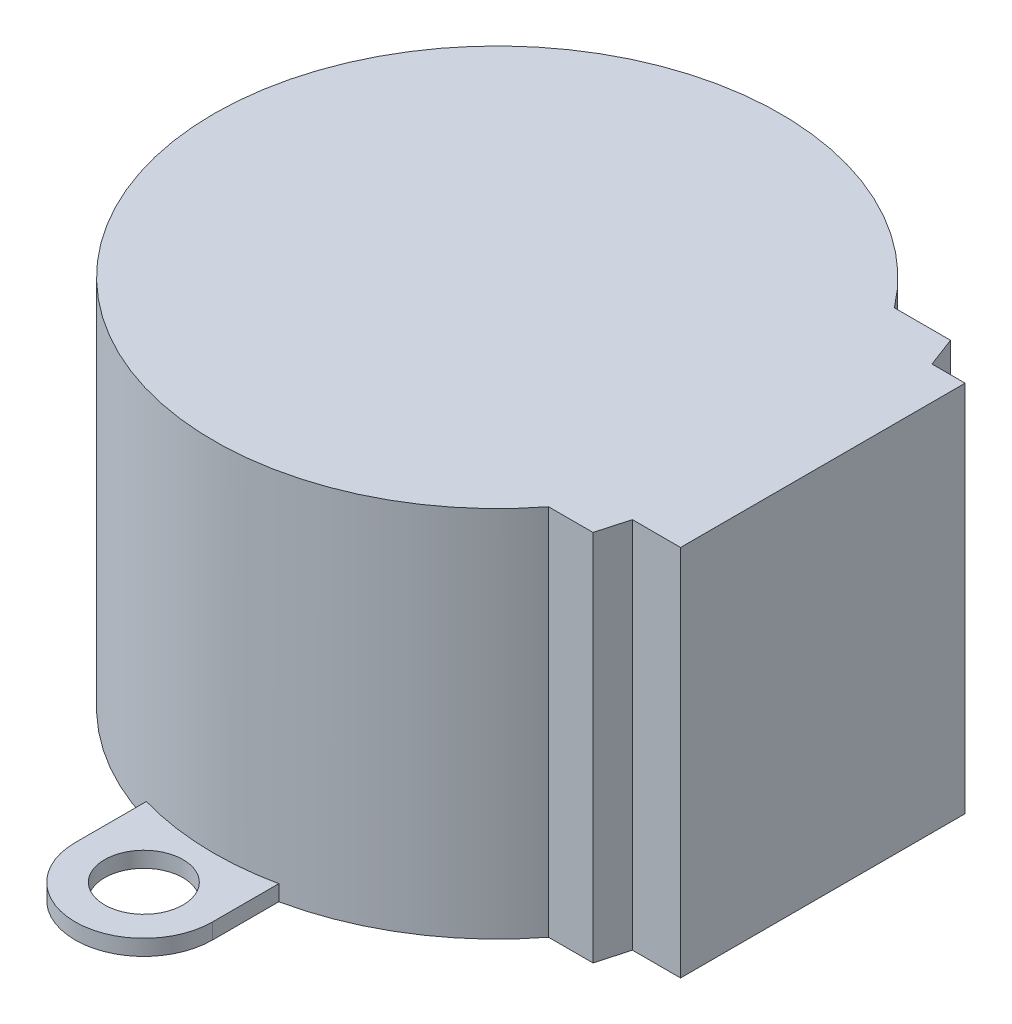
ISO-10303-21;
HEADER;
FILE_DESCRIPTION(('STEP AP214'),'2;1');
FILE_NAME('part.step','',(''),(''),'','','');
FILE_SCHEMA(('AUTOMOTIVE_DESIGN { 1 0 10303 214 1 1 1 1 }'));
ENDSEC;
DATA;
#1=APPLICATION_CONTEXT('core data for automotive mechanical design processes');
#2=APPLICATION_PROTOCOL_DEFINITION('international standard','automotive_design',2000,#1);
#3=PRODUCT_CONTEXT('',#1,'mechanical');
#4=PRODUCT('Part','Part','',(#3));
#5=PRODUCT_RELATED_PRODUCT_CATEGORY('part','',(#4));
#6=PRODUCT_DEFINITION_FORMATION('','',#4);
#7=PRODUCT_DEFINITION_CONTEXT('part definition',#1,'design');
#8=PRODUCT_DEFINITION('design','',#6,#7);
#9=PRODUCT_DEFINITION_SHAPE('','',#8);
#10=(LENGTH_UNIT() NAMED_UNIT(*) SI_UNIT(.MILLI.,.METRE.));
#11=(NAMED_UNIT(*) PLANE_ANGLE_UNIT() SI_UNIT($,.RADIAN.));
#12=(NAMED_UNIT(*) SI_UNIT($,.STERADIAN.) SOLID_ANGLE_UNIT());
#13=UNCERTAINTY_MEASURE_WITH_UNIT(LENGTH_MEASURE(1.E-05),#10,'distance_accuracy_value','');
#14=(GEOMETRIC_REPRESENTATION_CONTEXT(3) GLOBAL_UNCERTAINTY_ASSIGNED_CONTEXT((#13)) GLOBAL_UNIT_ASSIGNED_CONTEXT((#10,
#11,#12)) REPRESENTATION_CONTEXT('',''));
#15=CARTESIAN_POINT('',(0.,0.,0.));
#16=DIRECTION('',(0.,0.,1.));
#17=DIRECTION('',(1.,0.,0.));
#18=AXIS2_PLACEMENT_3D('',#15,#16,#17);
#19=CARTESIAN_POINT('',(0.,19.,0.));
#20=DIRECTION('',(0.,-1.,0.));
#21=DIRECTION('',(0.,0.,-1.));
#22=AXIS2_PLACEMENT_3D('',#19,#20,#21);
#23=CYLINDRICAL_SURFACE('',#22,14.436967708982);
#24=CARTESIAN_POINT('',(0.,0.,0.));
#25=DIRECTION('',(0.,1.,0.));
#26=DIRECTION('',(0.,0.,1.));
#27=AXIS2_PLACEMENT_3D('',#24,#25,#26);
#28=CIRCLE('',#27,14.436967708982);
#29=CARTESIAN_POINT('',(-4.00623475222368,0.,-13.8699718723675));
#30=VERTEX_POINT('',#29);
#31=CARTESIAN_POINT('',(-4.00623475222368,0.,13.8699718723675));
#32=VERTEX_POINT('',#31);
#33=EDGE_CURVE('E441',#30,#32,#28,.T.);
#34=ORIENTED_EDGE('',*,*,#33,.T.);
#35=DIRECTION('',(0.,-1.,0.));
#36=VECTOR('',#35,1.);
#37=CARTESIAN_POINT('',(-4.00623475222368,0.8,13.8699718723675));
#38=LINE('',#37,#36);
#39=CARTESIAN_POINT('',(-4.00623475222368,0.799999999999999,13.8699718723675));
#40=VERTEX_POINT('',#39);
#41=EDGE_CURVE('E323',#40,#32,#38,.T.);
#42=ORIENTED_EDGE('',*,*,#41,.F.);
#43=CARTESIAN_POINT('',(0.,0.8,0.));
#44=DIRECTION('',(0.,1.,0.));
#45=DIRECTION('',(0.,0.,1.));
#46=AXIS2_PLACEMENT_3D('',#43,#44,#45);
#47=CIRCLE('',#46,14.436967708982);
#48=CARTESIAN_POINT('',(2.99376524777633,0.799999999999999,14.1231514284665));
#49=VERTEX_POINT('',#48);
#50=EDGE_CURVE('E320',#40,#49,#47,.T.);
#51=ORIENTED_EDGE('',*,*,#50,.T.);
#52=DIRECTION('',(0.,-1.,0.));
#53=VECTOR('',#52,1.);
#54=CARTESIAN_POINT('',(2.99376524777633,0.8,14.1231514284665));
#55=LINE('',#54,#53);
#56=CARTESIAN_POINT('',(2.99376524777633,0.,14.1231514284665));
#57=VERTEX_POINT('',#56);
#58=EDGE_CURVE('E341',#49,#57,#55,.T.);
#59=ORIENTED_EDGE('',*,*,#58,.T.);
#60=CARTESIAN_POINT('',(11.4313797143374,0.,8.81757304800058));
#61=VERTEX_POINT('',#60);
#62=EDGE_CURVE('E403',#57,#61,#28,.T.);
#63=ORIENTED_EDGE('',*,*,#62,.T.);
#64=DIRECTION('',(0.,-1.,0.));
#65=VECTOR('',#64,1.);
#66=CARTESIAN_POINT('',(11.4313797143374,19.,8.81757304800058));
#67=LINE('',#66,#65);
#68=CARTESIAN_POINT('',(11.4313797143374,19.,8.81757304800058));
#69=VERTEX_POINT('',#68);
#70=EDGE_CURVE('E260',#69,#61,#67,.T.);
#71=ORIENTED_EDGE('',*,*,#70,.F.);
#72=CARTESIAN_POINT('',(0.,19.,0.));
#73=DIRECTION('',(0.,1.,0.));
#74=DIRECTION('',(0.,0.,1.));
#75=AXIS2_PLACEMENT_3D('',#72,#73,#74);
#76=CIRCLE('',#75,14.436967708982);
#77=CARTESIAN_POINT('',(11.4669357034647,19.,-8.77128395406261));
#78=VERTEX_POINT('',#77);
#79=EDGE_CURVE('E407',#78,#69,#76,.T.);
#80=ORIENTED_EDGE('',*,*,#79,.F.);
#81=DIRECTION('',(0.,-1.,0.));
#82=VECTOR('',#81,1.);
#83=CARTESIAN_POINT('',(11.4669357034647,19.,-8.77128395406261));
#84=LINE('',#83,#82);
#85=CARTESIAN_POINT('',(11.4669357034647,0.,-8.77128395406261));
#86=VERTEX_POINT('',#85);
#87=EDGE_CURVE('E437',#78,#86,#84,.T.);
#88=ORIENTED_EDGE('',*,*,#87,.T.);
#89=CARTESIAN_POINT('',(2.99376524777633,0.,-14.1231514284665));
#90=VERTEX_POINT('',#89);
#91=EDGE_CURVE('E438',#86,#90,#28,.T.);
#92=ORIENTED_EDGE('',*,*,#91,.T.);
#93=DIRECTION('',(0.,-1.,0.));
#94=VECTOR('',#93,1.);
#95=CARTESIAN_POINT('',(2.99376524777633,0.8,-14.1231514284665));
#96=LINE('',#95,#94);
#97=CARTESIAN_POINT('',(2.99376524777633,0.799999999999999,-14.1231514284665));
#98=VERTEX_POINT('',#97);
#99=EDGE_CURVE('E372',#98,#90,#96,.T.);
#100=ORIENTED_EDGE('',*,*,#99,.F.);
#101=CARTESIAN_POINT('',(0.,0.8,0.));
#102=DIRECTION('',(0.,1.,0.));
#103=DIRECTION('',(0.,0.,1.));
#104=AXIS2_PLACEMENT_3D('',#101,#102,#103);
#105=CIRCLE('',#104,14.436967708982);
#106=CARTESIAN_POINT('',(-4.00623475222368,0.799999999999999,-13.8699718723675));
#107=VERTEX_POINT('',#106);
#108=EDGE_CURVE('E369',#98,#107,#105,.T.);
#109=ORIENTED_EDGE('',*,*,#108,.T.);
#110=DIRECTION('',(0.,-1.,0.));
#111=VECTOR('',#110,1.);
#112=CARTESIAN_POINT('',(-4.00623475222368,0.8,-13.8699718723675));
#113=LINE('',#112,#111);
#114=EDGE_CURVE('E388',#107,#30,#113,.T.);
#115=ORIENTED_EDGE('',*,*,#114,.T.);
#116=EDGE_LOOP('',(#34,#42,#51,#59,#63,#71,#80,#88,#92,#100,#109,#115));
#117=FACE_BOUND('',#116,.T.);
#118=ADVANCED_FACE('F40',(#117),#23,.T.);
#119=CARTESIAN_POINT('',(0.,19.,8.81757304800058));
#120=DIRECTION('',(0.,0.,-1.));
#121=DIRECTION('',(-1.,0.,0.));
#122=AXIS2_PLACEMENT_3D('',#119,#120,#121);
#123=PLANE('',#122);
#124=DIRECTION('',(1.,0.,0.));
#125=VECTOR('',#124,1.);
#126=CARTESIAN_POINT('',(0.,0.,8.81757304800058));
#127=LINE('',#126,#125);
#128=CARTESIAN_POINT('',(13.7006228905011,0.,8.81757304800058));
#129=VERTEX_POINT('',#128);
#130=EDGE_CURVE('E440',#61,#129,#127,.T.);
#131=ORIENTED_EDGE('',*,*,#130,.T.);
#132=DIRECTION('',(0.,-1.,0.));
#133=VECTOR('',#132,1.);
#134=CARTESIAN_POINT('',(13.7006228905011,19.,8.81757304800058));
#135=LINE('',#134,#133);
#136=CARTESIAN_POINT('',(13.7006228905011,19.,8.81757304800058));
#137=VERTEX_POINT('',#136);
#138=EDGE_CURVE('E478',#137,#129,#135,.T.);
#139=ORIENTED_EDGE('',*,*,#138,.F.);
#140=DIRECTION('',(1.,0.,0.));
#141=VECTOR('',#140,1.);
#142=CARTESIAN_POINT('',(0.,19.,8.81757304800058));
#143=LINE('',#142,#141);
#144=EDGE_CURVE('E411',#69,#137,#143,.T.);
#145=ORIENTED_EDGE('',*,*,#144,.F.);
#146=ORIENTED_EDGE('',*,*,#70,.T.);
#147=EDGE_LOOP('',(#131,#139,#145,#146));
#148=FACE_BOUND('',#147,.T.);
#149=ADVANCED_FACE('F495',(#148),#123,.F.);
#150=CARTESIAN_POINT('',(14.9938451519472,19.,4.1919357019295));
#151=DIRECTION('',(-0.963069694716314,0.,-0.269252229552563));
#152=DIRECTION('',(-0.269252229552563,0.,0.963069694716314));
#153=AXIS2_PLACEMENT_3D('',#150,#151,#152);
#154=PLANE('',#153);
#155=DIRECTION('',(0.269252229552563,0.,-0.963069694716314));
#156=VECTOR('',#155,1.);
#157=CARTESIAN_POINT('',(14.9938451519472,0.,4.1919357019295));
#158=LINE('',#157,#156);
#159=CARTESIAN_POINT('',(14.1388804127513,0.,7.25));
#160=VERTEX_POINT('',#159);
#161=EDGE_CURVE('E443',#129,#160,#158,.T.);
#162=ORIENTED_EDGE('',*,*,#161,.T.);
#163=DIRECTION('',(0.,-1.,0.));
#164=VECTOR('',#163,1.);
#165=CARTESIAN_POINT('',(14.1388804127513,19.,7.25));
#166=LINE('',#165,#164);
#167=CARTESIAN_POINT('',(14.1388804127513,19.,7.25));
#168=VERTEX_POINT('',#167);
#169=EDGE_CURVE('E474',#168,#160,#166,.T.);
#170=ORIENTED_EDGE('',*,*,#169,.F.);
#171=DIRECTION('',(0.269252229552563,0.,-0.963069694716314));
#172=VECTOR('',#171,1.);
#173=CARTESIAN_POINT('',(14.9938451519472,19.,4.1919357019295));
#174=LINE('',#173,#172);
#175=EDGE_CURVE('E415',#137,#168,#174,.T.);
#176=ORIENTED_EDGE('',*,*,#175,.F.);
#177=ORIENTED_EDGE('',*,*,#138,.T.);
#178=EDGE_LOOP('',(#162,#170,#176,#177));
#179=FACE_BOUND('',#178,.T.);
#180=ADVANCED_FACE('F500',(#179),#154,.F.);
#181=CARTESIAN_POINT('',(0.,19.,7.25));
#182=DIRECTION('',(0.,0.,-1.));
#183=DIRECTION('',(-1.,0.,0.));
#184=AXIS2_PLACEMENT_3D('',#181,#182,#183);
#185=PLANE('',#184);
#186=DIRECTION('',(1.,0.,0.));
#187=VECTOR('',#186,1.);
#188=CARTESIAN_POINT('',(0.,0.,7.25));
#189=LINE('',#188,#187);
#190=CARTESIAN_POINT('',(16.5937652477763,0.,7.25));
#191=VERTEX_POINT('',#190);
#192=EDGE_CURVE('E445',#160,#191,#189,.T.);
#193=ORIENTED_EDGE('',*,*,#192,.T.);
#194=DIRECTION('',(0.,-1.,0.));
#195=VECTOR('',#194,1.);
#196=CARTESIAN_POINT('',(16.5937652477763,19.,7.25));
#197=LINE('',#196,#195);
#198=CARTESIAN_POINT('',(16.5937652477763,19.,7.25));
#199=VERTEX_POINT('',#198);
#200=EDGE_CURVE('E471',#199,#191,#197,.T.);
#201=ORIENTED_EDGE('',*,*,#200,.F.);
#202=DIRECTION('',(1.,0.,0.));
#203=VECTOR('',#202,1.);
#204=CARTESIAN_POINT('',(0.,19.,7.25));
#205=LINE('',#204,#203);
#206=EDGE_CURVE('E418',#168,#199,#205,.T.);
#207=ORIENTED_EDGE('',*,*,#206,.F.);
#208=ORIENTED_EDGE('',*,*,#169,.T.);
#209=EDGE_LOOP('',(#193,#201,#207,#208));
#210=FACE_BOUND('',#209,.T.);
#211=ADVANCED_FACE('F506',(#210),#185,.F.);
#212=CARTESIAN_POINT('',(16.5937652477763,19.,0.));
#213=DIRECTION('',(1.,0.,0.));
#214=DIRECTION('',(0.,0.,-1.));
#215=AXIS2_PLACEMENT_3D('',#212,#213,#214);
#216=PLANE('',#215);
#217=DIRECTION('',(0.,0.,1.));
#218=VECTOR('',#217,1.);
#219=CARTESIAN_POINT('',(16.5937652477763,0.,0.));
#220=LINE('',#219,#218);
#221=CARTESIAN_POINT('',(16.5937652477763,0.,-7.25));
#222=VERTEX_POINT('',#221);
#223=EDGE_CURVE('E448',#222,#191,#220,.T.);
#224=ORIENTED_EDGE('',*,*,#223,.F.);
#225=DIRECTION('',(0.,-1.,0.));
#226=VECTOR('',#225,1.);
#227=CARTESIAN_POINT('',(16.5937652477763,19.,-7.25));
#228=LINE('',#227,#226);
#229=CARTESIAN_POINT('',(16.5937652477763,19.,-7.25));
#230=VERTEX_POINT('',#229);
#231=EDGE_CURVE('E468',#230,#222,#228,.T.);
#232=ORIENTED_EDGE('',*,*,#231,.F.);
#233=DIRECTION('',(0.,0.,1.));
#234=VECTOR('',#233,1.);
#235=CARTESIAN_POINT('',(16.5937652477763,19.,0.));
#236=LINE('',#235,#234);
#237=EDGE_CURVE('E421',#230,#199,#236,.T.);
#238=ORIENTED_EDGE('',*,*,#237,.T.);
#239=ORIENTED_EDGE('',*,*,#200,.T.);
#240=EDGE_LOOP('',(#224,#232,#238,#239));
#241=FACE_BOUND('',#240,.T.);
#242=ADVANCED_FACE('F510',(#241),#216,.T.);
#243=CARTESIAN_POINT('',(0.,19.,-7.25));
#244=DIRECTION('',(0.,0.,-1.));
#245=DIRECTION('',(-1.,0.,0.));
#246=AXIS2_PLACEMENT_3D('',#243,#244,#245);
#247=PLANE('',#246);
#248=DIRECTION('',(1.,0.,0.));
#249=VECTOR('',#248,1.);
#250=CARTESIAN_POINT('',(0.,0.,-7.25));
#251=LINE('',#250,#249);
#252=CARTESIAN_POINT('',(14.9056443314998,0.,-7.25));
#253=VERTEX_POINT('',#252);
#254=EDGE_CURVE('E452',#253,#222,#251,.T.);
#255=ORIENTED_EDGE('',*,*,#254,.F.);
#256=DIRECTION('',(0.,-1.,0.));
#257=VECTOR('',#256,1.);
#258=CARTESIAN_POINT('',(14.9056443314998,19.,-7.25));
#259=LINE('',#258,#257);
#260=CARTESIAN_POINT('',(14.9056443314998,19.,-7.25));
#261=VERTEX_POINT('',#260);
#262=EDGE_CURVE('E465',#261,#253,#259,.T.);
#263=ORIENTED_EDGE('',*,*,#262,.F.);
#264=DIRECTION('',(1.,0.,0.));
#265=VECTOR('',#264,1.);
#266=CARTESIAN_POINT('',(0.,19.,-7.25));
#267=LINE('',#266,#265);
#268=EDGE_CURVE('E425',#261,#230,#267,.T.);
#269=ORIENTED_EDGE('',*,*,#268,.T.);
#270=ORIENTED_EDGE('',*,*,#231,.T.);
#271=EDGE_LOOP('',(#255,#263,#269,#270));
#272=FACE_BOUND('',#271,.T.);
#273=ADVANCED_FACE('F514',(#272),#247,.T.);
#274=CARTESIAN_POINT('',(15.4303055956468,19.,-5.87109469079413));
#275=DIRECTION('',(0.934631068762392,0.,-0.355618848353217));
#276=DIRECTION('',(-0.355618848353217,0.,-0.934631068762392));
#277=AXIS2_PLACEMENT_3D('',#274,#275,#276);
#278=PLANE('',#277);
#279=DIRECTION('',(0.355618848353217,0.,0.934631068762392));
#280=VECTOR('',#279,1.);
#281=CARTESIAN_POINT('',(15.4303055956468,0.,-5.87109469079413));
#282=LINE('',#281,#280);
#283=CARTESIAN_POINT('',(14.326809253314,0.,-8.77128395406261));
#284=VERTEX_POINT('',#283);
#285=EDGE_CURVE('E455',#284,#253,#282,.T.);
#286=ORIENTED_EDGE('',*,*,#285,.F.);
#287=DIRECTION('',(0.,-1.,0.));
#288=VECTOR('',#287,1.);
#289=CARTESIAN_POINT('',(14.326809253314,19.,-8.77128395406261));
#290=LINE('',#289,#288);
#291=CARTESIAN_POINT('',(14.326809253314,19.,-8.77128395406261));
#292=VERTEX_POINT('',#291);
#293=EDGE_CURVE('E462',#292,#284,#290,.T.);
#294=ORIENTED_EDGE('',*,*,#293,.F.);
#295=DIRECTION('',(0.355618848353217,0.,0.934631068762392));
#296=VECTOR('',#295,1.);
#297=CARTESIAN_POINT('',(15.4303055956468,19.,-5.87109469079413));
#298=LINE('',#297,#296);
#299=EDGE_CURVE('E429',#292,#261,#298,.T.);
#300=ORIENTED_EDGE('',*,*,#299,.T.);
#301=ORIENTED_EDGE('',*,*,#262,.T.);
#302=EDGE_LOOP('',(#286,#294,#300,#301));
#303=FACE_BOUND('',#302,.T.);
#304=ADVANCED_FACE('F518',(#303),#278,.T.);
#305=CARTESIAN_POINT('',(0.,19.,-8.77128395406261));
#306=DIRECTION('',(0.,0.,-1.));
#307=DIRECTION('',(-1.,0.,0.));
#308=AXIS2_PLACEMENT_3D('',#305,#306,#307);
#309=PLANE('',#308);
#310=DIRECTION('',(1.,0.,0.));
#311=VECTOR('',#310,1.);
#312=CARTESIAN_POINT('',(0.,0.,-8.77128395406261));
#313=LINE('',#312,#311);
#314=EDGE_CURVE('E412',#86,#284,#313,.T.);
#315=ORIENTED_EDGE('',*,*,#314,.F.);
#316=ORIENTED_EDGE('',*,*,#87,.F.);
#317=DIRECTION('',(1.,0.,0.));
#318=VECTOR('',#317,1.);
#319=CARTESIAN_POINT('',(0.,19.,-8.77128395406261));
#320=LINE('',#319,#318);
#321=EDGE_CURVE('E433',#78,#292,#320,.T.);
#322=ORIENTED_EDGE('',*,*,#321,.T.);
#323=ORIENTED_EDGE('',*,*,#293,.T.);
#324=EDGE_LOOP('',(#315,#316,#322,#323));
#325=FACE_BOUND('',#324,.T.);
#326=ADVANCED_FACE('F522',(#325),#309,.T.);
#327=CARTESIAN_POINT('',(0.,19.,0.));
#328=DIRECTION('',(0.,1.,0.));
#329=DIRECTION('',(0.,0.,1.));
#330=AXIS2_PLACEMENT_3D('',#327,#328,#329);
#331=PLANE('',#330);
#332=ORIENTED_EDGE('',*,*,#79,.T.);
#333=ORIENTED_EDGE('',*,*,#144,.T.);
#334=ORIENTED_EDGE('',*,*,#175,.T.);
#335=ORIENTED_EDGE('',*,*,#206,.T.);
#336=ORIENTED_EDGE('',*,*,#237,.F.);
#337=ORIENTED_EDGE('',*,*,#268,.F.);
#338=ORIENTED_EDGE('',*,*,#299,.F.);
#339=ORIENTED_EDGE('',*,*,#321,.F.);
#340=EDGE_LOOP('',(#332,#333,#334,#335,#336,#337,#338,#339));
#341=FACE_BOUND('',#340,.T.);
#342=ADVANCED_FACE('F526',(#341),#331,.T.);
#343=CARTESIAN_POINT('',(0.,0.,0.));
#344=DIRECTION('',(0.,1.,0.));
#345=DIRECTION('',(0.,0.,1.));
#346=AXIS2_PLACEMENT_3D('',#343,#344,#345);
#347=PLANE('',#346);
#348=CARTESIAN_POINT('',(-8.50623475222368,0.,0.));
#349=DIRECTION('',(0.,1.,0.));
#350=DIRECTION('',(0.,0.,1.));
#351=AXIS2_PLACEMENT_3D('',#348,#349,#350);
#352=CIRCLE('',#351,4.6);
#353=CARTESIAN_POINT('',(-8.50623475222368,0.,4.6));
#354=VERTEX_POINT('',#353);
#355=EDGE_CURVE('E398',#354,#354,#352,.T.);
#356=ORIENTED_EDGE('',*,*,#355,.T.);
#357=EDGE_LOOP('',(#356));
#358=FACE_BOUND('',#357,.T.);
#359=ORIENTED_EDGE('',*,*,#91,.F.);
#360=ORIENTED_EDGE('',*,*,#314,.T.);
#361=ORIENTED_EDGE('',*,*,#285,.T.);
#362=ORIENTED_EDGE('',*,*,#254,.T.);
#363=ORIENTED_EDGE('',*,*,#223,.T.);
#364=ORIENTED_EDGE('',*,*,#192,.F.);
#365=ORIENTED_EDGE('',*,*,#161,.F.);
#366=ORIENTED_EDGE('',*,*,#130,.F.);
#367=ORIENTED_EDGE('',*,*,#62,.F.);
#368=DIRECTION('',(0.,0.,-1.));
#369=VECTOR('',#368,1.);
#370=CARTESIAN_POINT('',(2.99376524777633,0.,0.));
#371=LINE('',#370,#369);
#372=CARTESIAN_POINT('',(2.99376524777633,0.,17.5));
#373=VERTEX_POINT('',#372);
#374=EDGE_CURVE('E308',#373,#57,#371,.T.);
#375=ORIENTED_EDGE('',*,*,#374,.F.);
#376=CARTESIAN_POINT('',(-0.506234752223674,0.,17.5));
#377=DIRECTION('',(0.,1.,0.));
#378=DIRECTION('',(0.,0.,1.));
#379=AXIS2_PLACEMENT_3D('',#376,#377,#378);
#380=CIRCLE('',#379,3.5);
#381=CARTESIAN_POINT('',(-4.00623475222368,0.,17.5));
#382=VERTEX_POINT('',#381);
#383=EDGE_CURVE('E331',#382,#373,#380,.T.);
#384=ORIENTED_EDGE('',*,*,#383,.F.);
#385=DIRECTION('',(0.,0.,-1.));
#386=VECTOR('',#385,1.);
#387=CARTESIAN_POINT('',(-4.00623475222368,0.,0.));
#388=LINE('',#387,#386);
#389=EDGE_CURVE('E327',#382,#32,#388,.T.);
#390=ORIENTED_EDGE('',*,*,#389,.T.);
#391=ORIENTED_EDGE('',*,*,#33,.F.);
#392=DIRECTION('',(0.,0.,1.));
#393=VECTOR('',#392,1.);
#394=CARTESIAN_POINT('',(-4.00623475222368,0.,0.));
#395=LINE('',#394,#393);
#396=CARTESIAN_POINT('',(-4.00623475222368,0.,-17.5));
#397=VERTEX_POINT('',#396);
#398=EDGE_CURVE('E358',#397,#30,#395,.T.);
#399=ORIENTED_EDGE('',*,*,#398,.F.);
#400=CARTESIAN_POINT('',(-0.506234752223679,0.,-17.5));
#401=DIRECTION('',(0.,1.,0.));
#402=DIRECTION('',(0.,0.,1.));
#403=AXIS2_PLACEMENT_3D('',#400,#401,#402);
#404=CIRCLE('',#403,3.5);
#405=CARTESIAN_POINT('',(2.99376524777633,0.,-17.5));
#406=VERTEX_POINT('',#405);
#407=EDGE_CURVE('E379',#406,#397,#404,.T.);
#408=ORIENTED_EDGE('',*,*,#407,.F.);
#409=DIRECTION('',(0.,0.,1.));
#410=VECTOR('',#409,1.);
#411=CARTESIAN_POINT('',(2.99376524777633,0.,0.));
#412=LINE('',#411,#410);
#413=EDGE_CURVE('E376',#406,#90,#412,.T.);
#414=ORIENTED_EDGE('',*,*,#413,.T.);
#415=EDGE_LOOP('',(#359,#360,#361,#362,#363,#364,#365,#366,#367,#375,#384,#390,#391,#399,#408,#414));
#416=FACE_BOUND('',#415,.T.);
#417=CARTESIAN_POINT('',(-0.506234752223679,0.,-17.5));
#418=DIRECTION('',(0.,1.,0.));
#419=DIRECTION('',(0.,0.,1.));
#420=AXIS2_PLACEMENT_3D('',#417,#418,#419);
#421=CIRCLE('',#420,2.);
#422=CARTESIAN_POINT('',(-0.506234752223679,0.,-15.5));
#423=VERTEX_POINT('',#422);
#424=EDGE_CURVE('E352',#423,#423,#421,.T.);
#425=ORIENTED_EDGE('',*,*,#424,.T.);
#426=EDGE_LOOP('',(#425));
#427=FACE_BOUND('',#426,.T.);
#428=CARTESIAN_POINT('',(-0.506234752223674,0.,17.5));
#429=DIRECTION('',(0.,1.,0.));
#430=DIRECTION('',(0.,0.,1.));
#431=AXIS2_PLACEMENT_3D('',#428,#429,#430);
#432=CIRCLE('',#431,2.);
#433=CARTESIAN_POINT('',(-0.506234752223674,0.,19.5));
#434=VERTEX_POINT('',#433);
#435=EDGE_CURVE('E245',#434,#434,#432,.T.);
#436=ORIENTED_EDGE('',*,*,#435,.T.);
#437=EDGE_LOOP('',(#436));
#438=FACE_BOUND('',#437,.T.);
#439=ADVANCED_FACE('F528',(#358,#416,#427,#438),#347,.F.);
#440=CARTESIAN_POINT('',(-8.50623475222368,-1.6,0.));
#441=DIRECTION('',(0.,1.,0.));
#442=DIRECTION('',(0.,0.,1.));
#443=AXIS2_PLACEMENT_3D('',#440,#441,#442);
#444=CYLINDRICAL_SURFACE('',#443,4.6);
#445=CARTESIAN_POINT('',(-8.50623475222368,-1.6,0.));
#446=DIRECTION('',(0.,1.,0.));
#447=DIRECTION('',(0.,0.,1.));
#448=AXIS2_PLACEMENT_3D('',#445,#446,#447);
#449=CIRCLE('',#448,4.6);
#450=CARTESIAN_POINT('',(-8.50623475222368,-1.6,4.6));
#451=VERTEX_POINT('',#450);
#452=EDGE_CURVE('E399',#451,#451,#449,.T.);
#453=ORIENTED_EDGE('',*,*,#452,.T.);
#454=EDGE_LOOP('',(#453));
#455=FACE_BOUND('',#454,.T.);
#456=ORIENTED_EDGE('',*,*,#355,.F.);
#457=EDGE_LOOP('',(#456));
#458=FACE_BOUND('',#457,.T.);
#459=ADVANCED_FACE('F531',(#455,#458),#444,.T.);
#460=CARTESIAN_POINT('',(0.,-1.6,0.));
#461=DIRECTION('',(0.,1.,0.));
#462=DIRECTION('',(0.,0.,1.));
#463=AXIS2_PLACEMENT_3D('',#460,#461,#462);
#464=PLANE('',#463);
#465=CARTESIAN_POINT('',(-8.50623475222368,-1.6,0.));
#466=DIRECTION('',(0.,1.,0.));
#467=DIRECTION('',(0.,0.,1.));
#468=AXIS2_PLACEMENT_3D('',#465,#466,#467);
#469=CIRCLE('',#468,2.5);
#470=CARTESIAN_POINT('',(-8.50623475222368,-1.6,2.5));
#471=VERTEX_POINT('',#470);
#472=EDGE_CURVE('E240',#471,#471,#469,.T.);
#473=ORIENTED_EDGE('',*,*,#472,.T.);
#474=EDGE_LOOP('',(#473));
#475=FACE_BOUND('',#474,.T.);
#476=ORIENTED_EDGE('',*,*,#452,.F.);
#477=EDGE_LOOP('',(#476));
#478=FACE_BOUND('',#477,.T.);
#479=ADVANCED_FACE('F538',(#475,#478),#464,.F.);
#480=CARTESIAN_POINT('',(2.99376524777633,0.8,0.));
#481=DIRECTION('',(1.,0.,0.));
#482=DIRECTION('',(0.,0.,-1.));
#483=AXIS2_PLACEMENT_3D('',#480,#481,#482);
#484=PLANE('',#483);
#485=ORIENTED_EDGE('',*,*,#413,.F.);
#486=DIRECTION('',(0.,-1.,0.));
#487=VECTOR('',#486,1.);
#488=CARTESIAN_POINT('',(2.99376524777633,0.8,-17.5));
#489=LINE('',#488,#487);
#490=CARTESIAN_POINT('',(2.99376524777633,0.8,-17.5));
#491=VERTEX_POINT('',#490);
#492=EDGE_CURVE('E396',#491,#406,#489,.T.);
#493=ORIENTED_EDGE('',*,*,#492,.F.);
#494=DIRECTION('',(0.,0.,1.));
#495=VECTOR('',#494,1.);
#496=CARTESIAN_POINT('',(2.99376524777633,0.8,0.));
#497=LINE('',#496,#495);
#498=EDGE_CURVE('E357',#491,#98,#497,.T.);
#499=ORIENTED_EDGE('',*,*,#498,.T.);
#500=ORIENTED_EDGE('',*,*,#99,.T.);
#501=EDGE_LOOP('',(#485,#493,#499,#500));
#502=FACE_BOUND('',#501,.T.);
#503=ADVANCED_FACE('F542',(#502),#484,.T.);
#504=CARTESIAN_POINT('',(-0.506234752223679,0.8,-17.5));
#505=DIRECTION('',(0.,-1.,0.));
#506=DIRECTION('',(0.,0.,-1.));
#507=AXIS2_PLACEMENT_3D('',#504,#505,#506);
#508=CYLINDRICAL_SURFACE('',#507,3.5);
#509=ORIENTED_EDGE('',*,*,#407,.T.);
#510=DIRECTION('',(0.,-1.,0.));
#511=VECTOR('',#510,1.);
#512=CARTESIAN_POINT('',(-4.00623475222368,0.8,-17.5));
#513=LINE('',#512,#511);
#514=CARTESIAN_POINT('',(-4.00623475222368,0.8,-17.5));
#515=VERTEX_POINT('',#514);
#516=EDGE_CURVE('E392',#515,#397,#513,.T.);
#517=ORIENTED_EDGE('',*,*,#516,.F.);
#518=CARTESIAN_POINT('',(-0.506234752223679,0.8,-17.5));
#519=DIRECTION('',(0.,1.,0.));
#520=DIRECTION('',(0.,0.,1.));
#521=AXIS2_PLACEMENT_3D('',#518,#519,#520);
#522=CIRCLE('',#521,3.5);
#523=EDGE_CURVE('E361',#491,#515,#522,.T.);
#524=ORIENTED_EDGE('',*,*,#523,.F.);
#525=ORIENTED_EDGE('',*,*,#492,.T.);
#526=EDGE_LOOP('',(#509,#517,#524,#525));
#527=FACE_BOUND('',#526,.T.);
#528=ADVANCED_FACE('F552',(#527),#508,.T.);
#529=CARTESIAN_POINT('',(-4.00623475222368,0.8,0.));
#530=DIRECTION('',(1.,0.,0.));
#531=DIRECTION('',(0.,0.,-1.));
#532=AXIS2_PLACEMENT_3D('',#529,#530,#531);
#533=PLANE('',#532);
#534=ORIENTED_EDGE('',*,*,#398,.T.);
#535=ORIENTED_EDGE('',*,*,#114,.F.);
#536=DIRECTION('',(0.,0.,1.));
#537=VECTOR('',#536,1.);
#538=CARTESIAN_POINT('',(-4.00623475222368,0.8,0.));
#539=LINE('',#538,#537);
#540=EDGE_CURVE('E365',#515,#107,#539,.T.);
#541=ORIENTED_EDGE('',*,*,#540,.F.);
#542=ORIENTED_EDGE('',*,*,#516,.T.);
#543=EDGE_LOOP('',(#534,#535,#541,#542));
#544=FACE_BOUND('',#543,.T.);
#545=ADVANCED_FACE('F548',(#544),#533,.F.);
#546=CARTESIAN_POINT('',(-0.506234752223679,0.8,-17.5));
#547=DIRECTION('',(0.,-1.,0.));
#548=DIRECTION('',(0.,0.,-1.));
#549=AXIS2_PLACEMENT_3D('',#546,#547,#548);
#550=CYLINDRICAL_SURFACE('',#549,2.);
#551=CARTESIAN_POINT('',(-0.506234752223679,0.8,-17.5));
#552=DIRECTION('',(0.,1.,0.));
#553=DIRECTION('',(0.,0.,1.));
#554=AXIS2_PLACEMENT_3D('',#551,#552,#553);
#555=CIRCLE('',#554,2.);
#556=CARTESIAN_POINT('',(-0.506234752223679,0.8,-15.5));
#557=VERTEX_POINT('',#556);
#558=EDGE_CURVE('E353',#557,#557,#555,.T.);
#559=ORIENTED_EDGE('',*,*,#558,.T.);
#560=EDGE_LOOP('',(#559));
#561=FACE_BOUND('',#560,.T.);
#562=ORIENTED_EDGE('',*,*,#424,.F.);
#563=EDGE_LOOP('',(#562));
#564=FACE_BOUND('',#563,.T.);
#565=ADVANCED_FACE('F544',(#561,#564),#550,.F.);
#566=CARTESIAN_POINT('',(0.,0.8,0.));
#567=DIRECTION('',(0.,1.,0.));
#568=DIRECTION('',(0.,0.,1.));
#569=AXIS2_PLACEMENT_3D('',#566,#567,#568);
#570=PLANE('',#569);
#571=ORIENTED_EDGE('',*,*,#558,.F.);
#572=EDGE_LOOP('',(#571));
#573=FACE_BOUND('',#572,.T.);
#574=ORIENTED_EDGE('',*,*,#498,.F.);
#575=ORIENTED_EDGE('',*,*,#523,.T.);
#576=ORIENTED_EDGE('',*,*,#540,.T.);
#577=ORIENTED_EDGE('',*,*,#108,.F.);
#578=EDGE_LOOP('',(#574,#575,#576,#577));
#579=FACE_BOUND('',#578,.T.);
#580=ADVANCED_FACE('F547',(#573,#579),#570,.T.);
#581=CARTESIAN_POINT('',(-4.00623475222368,0.8,0.));
#582=DIRECTION('',(-1.,0.,0.));
#583=DIRECTION('',(0.,0.,1.));
#584=AXIS2_PLACEMENT_3D('',#581,#582,#583);
#585=PLANE('',#584);
#586=ORIENTED_EDGE('',*,*,#389,.F.);
#587=DIRECTION('',(0.,-1.,0.));
#588=VECTOR('',#587,1.);
#589=CARTESIAN_POINT('',(-4.00623475222368,0.8,17.5));
#590=LINE('',#589,#588);
#591=CARTESIAN_POINT('',(-4.00623475222368,0.8,17.5));
#592=VERTEX_POINT('',#591);
#593=EDGE_CURVE('E349',#592,#382,#590,.T.);
#594=ORIENTED_EDGE('',*,*,#593,.F.);
#595=DIRECTION('',(0.,0.,-1.));
#596=VECTOR('',#595,1.);
#597=CARTESIAN_POINT('',(-4.00623475222368,0.8,0.));
#598=LINE('',#597,#596);
#599=EDGE_CURVE('E307',#592,#40,#598,.T.);
#600=ORIENTED_EDGE('',*,*,#599,.T.);
#601=ORIENTED_EDGE('',*,*,#41,.T.);
#602=EDGE_LOOP('',(#586,#594,#600,#601));
#603=FACE_BOUND('',#602,.T.);
#604=ADVANCED_FACE('F562',(#603),#585,.T.);
#605=CARTESIAN_POINT('',(-0.506234752223674,0.8,17.5));
#606=DIRECTION('',(0.,-1.,0.));
#607=DIRECTION('',(0.,0.,-1.));
#608=AXIS2_PLACEMENT_3D('',#605,#606,#607);
#609=CYLINDRICAL_SURFACE('',#608,3.5);
#610=ORIENTED_EDGE('',*,*,#383,.T.);
#611=DIRECTION('',(0.,-1.,0.));
#612=VECTOR('',#611,1.);
#613=CARTESIAN_POINT('',(2.99376524777633,0.8,17.5));
#614=LINE('',#613,#612);
#615=CARTESIAN_POINT('',(2.99376524777633,0.8,17.5));
#616=VERTEX_POINT('',#615);
#617=EDGE_CURVE('E345',#616,#373,#614,.T.);
#618=ORIENTED_EDGE('',*,*,#617,.F.);
#619=CARTESIAN_POINT('',(-0.506234752223674,0.8,17.5));
#620=DIRECTION('',(0.,1.,0.));
#621=DIRECTION('',(0.,0.,1.));
#622=AXIS2_PLACEMENT_3D('',#619,#620,#621);
#623=CIRCLE('',#622,3.5);
#624=EDGE_CURVE('E312',#592,#616,#623,.T.);
#625=ORIENTED_EDGE('',*,*,#624,.F.);
#626=ORIENTED_EDGE('',*,*,#593,.T.);
#627=EDGE_LOOP('',(#610,#618,#625,#626));
#628=FACE_BOUND('',#627,.T.);
#629=ADVANCED_FACE('F571',(#628),#609,.T.);
#630=CARTESIAN_POINT('',(2.99376524777633,0.8,0.));
#631=DIRECTION('',(-1.,0.,0.));
#632=DIRECTION('',(0.,0.,1.));
#633=AXIS2_PLACEMENT_3D('',#630,#631,#632);
#634=PLANE('',#633);
#635=ORIENTED_EDGE('',*,*,#374,.T.);
#636=ORIENTED_EDGE('',*,*,#58,.F.);
#637=DIRECTION('',(0.,0.,-1.));
#638=VECTOR('',#637,1.);
#639=CARTESIAN_POINT('',(2.99376524777633,0.8,0.));
#640=LINE('',#639,#638);
#641=EDGE_CURVE('E316',#616,#49,#640,.T.);
#642=ORIENTED_EDGE('',*,*,#641,.F.);
#643=ORIENTED_EDGE('',*,*,#617,.T.);
#644=EDGE_LOOP('',(#635,#636,#642,#643));
#645=FACE_BOUND('',#644,.T.);
#646=ADVANCED_FACE('F567',(#645),#634,.F.);
#647=CARTESIAN_POINT('',(-0.506234752223674,0.8,17.5));
#648=DIRECTION('',(0.,-1.,0.));
#649=DIRECTION('',(0.,0.,-1.));
#650=AXIS2_PLACEMENT_3D('',#647,#648,#649);
#651=CYLINDRICAL_SURFACE('',#650,2.);
#652=CARTESIAN_POINT('',(-0.506234752223674,0.8,17.5));
#653=DIRECTION('',(0.,1.,0.));
#654=DIRECTION('',(0.,0.,1.));
#655=AXIS2_PLACEMENT_3D('',#652,#653,#654);
#656=CIRCLE('',#655,2.);
#657=CARTESIAN_POINT('',(-0.506234752223674,0.8,19.5));
#658=VERTEX_POINT('',#657);
#659=EDGE_CURVE('E303',#658,#658,#656,.T.);
#660=ORIENTED_EDGE('',*,*,#659,.T.);
#661=EDGE_LOOP('',(#660));
#662=FACE_BOUND('',#661,.T.);
#663=ORIENTED_EDGE('',*,*,#435,.F.);
#664=EDGE_LOOP('',(#663));
#665=FACE_BOUND('',#664,.T.);
#666=ADVANCED_FACE('F564',(#662,#665),#651,.F.);
#667=CARTESIAN_POINT('',(0.,0.8,0.));
#668=DIRECTION('',(0.,1.,0.));
#669=DIRECTION('',(0.,0.,1.));
#670=AXIS2_PLACEMENT_3D('',#667,#668,#669);
#671=PLANE('',#670);
#672=ORIENTED_EDGE('',*,*,#659,.F.);
#673=EDGE_LOOP('',(#672));
#674=FACE_BOUND('',#673,.T.);
#675=ORIENTED_EDGE('',*,*,#599,.F.);
#676=ORIENTED_EDGE('',*,*,#624,.T.);
#677=ORIENTED_EDGE('',*,*,#641,.T.);
#678=ORIENTED_EDGE('',*,*,#50,.F.);
#679=EDGE_LOOP('',(#675,#676,#677,#678));
#680=FACE_BOUND('',#679,.T.);
#681=ADVANCED_FACE('F278',(#674,#680),#671,.T.);
#682=CARTESIAN_POINT('',(-8.50623475222368,-4.,0.));
#683=DIRECTION('',(0.,1.,0.));
#684=DIRECTION('',(0.,0.,1.));
#685=AXIS2_PLACEMENT_3D('',#682,#683,#684);
#686=CYLINDRICAL_SURFACE('',#685,2.5);
#687=DIRECTION('',(0.,1.,0.));
#688=VECTOR('',#687,1.);
#689=CARTESIAN_POINT('',(-10.5062347522237,-10.,1.5));
#690=LINE('',#689,#688);
#691=CARTESIAN_POINT('',(-10.5062347522237,-10.,1.5));
#692=VERTEX_POINT('',#691);
#693=CARTESIAN_POINT('',(-10.5062347522237,-5.,1.5));
#694=VERTEX_POINT('',#693);
#695=EDGE_CURVE('E247',#692,#694,#690,.T.);
#696=ORIENTED_EDGE('',*,*,#695,.T.);
#697=CARTESIAN_POINT('',(-10.5062347522237,-5.,1.5));
#698=CARTESIAN_POINT('',(-10.5062335179971,-4.97676225149139,1.49999830084557));
#699=CARTESIAN_POINT('',(-10.5056269747684,-4.95353630881955,1.50081072058559));
#700=CARTESIAN_POINT('',(-10.5032004416861,-4.90726446875307,1.50403926587182));
#701=CARTESIAN_POINT('',(-10.5013806899518,-4.88421853692513,1.50645507671632));
#702=CARTESIAN_POINT('',(-10.494116972096,-4.81575960207851,1.5160449621284));
#703=CARTESIAN_POINT('',(-10.4868685405439,-4.77083209370482,1.52556192920814));
#704=CARTESIAN_POINT('',(-10.4675924395529,-4.68368378113042,1.55026368463543));
#705=CARTESIAN_POINT('',(-10.4555652952964,-4.64146268008646,1.56544785014457));
#706=CARTESIAN_POINT('',(-10.4268397557606,-4.56074735368306,1.60055891928685));
#707=CARTESIAN_POINT('',(-10.4101402541182,-4.52225401392621,1.62048694604742));
#708=CARTESIAN_POINT('',(-10.3717989732296,-4.44880956159966,1.66449377708559));
#709=CARTESIAN_POINT('',(-10.3500391991614,-4.41397763823301,1.68866762969594));
#710=CARTESIAN_POINT('',(-10.302218875788,-4.34942934593038,1.73944251511171));
#711=CARTESIAN_POINT('',(-10.2761560910886,-4.31971565237175,1.76604480625132));
#712=CARTESIAN_POINT('',(-10.209055312641,-4.25460599172627,1.83121713206997));
#713=CARTESIAN_POINT('',(-10.1661838888838,-4.22164980554353,1.87033920684536));
#714=CARTESIAN_POINT('',(-10.0743471727502,-4.16476778045788,1.94798747224093));
#715=CARTESIAN_POINT('',(-10.0253711799968,-4.1408581032471,1.98651247957849));
#716=CARTESIAN_POINT('',(-9.93731123994006,-4.10626308976048,2.05038747818235));
#717=CARTESIAN_POINT('',(-9.89937247353519,-4.09375058667118,2.07636980470312));
#718=CARTESIAN_POINT('',(-9.82145694489983,-4.07193458366921,2.1265799426948));
#719=CARTESIAN_POINT('',(-9.78147929209808,-4.06263250006481,2.15080697608664));
#720=CARTESIAN_POINT('',(-9.65883863140166,-4.03860933009913,2.22043345824846));
#721=CARTESIAN_POINT('',(-9.57358803846396,-4.02781376908613,2.26269041498312));
#722=CARTESIAN_POINT('',(-9.42453900189612,-4.01485982870675,2.32620256664635));
#723=CARTESIAN_POINT('',(-9.36189308497093,-4.01108817162165,2.34996728629104));
#724=CARTESIAN_POINT('',(-9.23477290109006,-4.00557114346597,2.3924288907548));
#725=CARTESIAN_POINT('',(-9.17029776768879,-4.00382674963725,2.41112332811938));
#726=CARTESIAN_POINT('',(-9.04013121101674,-4.00148243349274,2.44324512662257));
#727=CARTESIAN_POINT('',(-8.97444151308069,-4.00088099735743,2.45667943590986));
#728=CARTESIAN_POINT('',(-8.84222438721211,-4.0001786866418,2.47822361899857));
#729=CARTESIAN_POINT('',(-8.77569748570162,-4.00007751186703,2.48633668341112));
#730=CARTESIAN_POINT('',(-8.67522158032311,-4.00001184096529,2.49451214519895));
#731=CARTESIAN_POINT('',(-8.64142392683551,-4.00000450495384,2.49657170199025));
#732=CARTESIAN_POINT('',(-8.57383029595875,-3.99999972389383,2.49931444187));
#733=CARTESIAN_POINT('',(-8.5400344131539,-4.00000226207289,2.49999995591882));
#734=CARTESIAN_POINT('',(-8.50623475222367,-4.,2.5));
#735=B_SPLINE_CURVE_WITH_KNOTS('',3,(#697,#698,#699,#700,#701,#702,#703,#704,#705,#706,#707,
#708,#709,#710,#711,#712,#713,#714,#715,#716,#717,#718,#719,#720,#721,#722,#723,#724,#725,#726,
#727,#728,#729,#730,#731,#732,#733,#734),.UNSPECIFIED.,.F.,.F.,(4,2,2,2,2,2,2,2,2,2,2,2,2,2,2,2,
2,2,4),(0.,0.0696679256697031,0.139322181478205,0.278058417432404,0.416779410436505,
0.555533278891729,0.697921487377383,0.840383899982876,1.0395031865621,1.23897654099019,
1.38175148916954,1.52458934365607,1.81072382391383,2.01183769876063,2.21304848035171,
2.41399257693819,2.61481607730566,2.71637299528517,2.81775748326735),.UNSPECIFIED.);
#736=CARTESIAN_POINT('',(-8.50623475222368,-4.,2.5));
#737=VERTEX_POINT('',#736);
#738=EDGE_CURVE('E266',#694,#737,#735,.T.);
#739=ORIENTED_EDGE('',*,*,#738,.T.);
#740=CARTESIAN_POINT('',(-8.50623475222368,-4.,2.5));
#741=CARTESIAN_POINT('',(-8.4712884246062,-4.00000258721339,2.50000005973691));
#742=CARTESIAN_POINT('',(-8.43634606743579,-3.9999996865796,2.49926717858351));
#743=CARTESIAN_POINT('',(-8.36652342427954,-4.00000514276057,2.49633767314957));
#744=CARTESIAN_POINT('',(-8.33164313714383,-4.00001349936456,2.49414107627372));
#745=CARTESIAN_POINT('',(-8.22714834795653,-4.00008882164115,2.48535667104289));
#746=CARTESIAN_POINT('',(-8.15770635261299,-4.00020607136883,2.47657425082874));
#747=CARTESIAN_POINT('',(-8.01926898161296,-4.0010298039886,2.45312652750474));
#748=CARTESIAN_POINT('',(-7.95028133630277,-4.00174088415416,2.43841579017993));
#749=CARTESIAN_POINT('',(-7.8138622782071,-4.00453676680161,2.40324533658573));
#750=CARTESIAN_POINT('',(-7.74643020672378,-4.00662097636379,2.38278810384935));
#751=CARTESIAN_POINT('',(-7.58333153289337,-4.01471195775157,2.32566130885523));
#752=CARTESIAN_POINT('',(-7.48877551621625,-4.02207183897278,2.28585009023618));
#753=CARTESIAN_POINT('',(-7.35206238908288,-4.0402448687237,2.21821419095569));
#754=CARTESIAN_POINT('',(-7.30740806216475,-4.04747523214108,2.19439073038703));
#755=CARTESIAN_POINT('',(-7.22007925716574,-4.06499582695026,2.14437217425247));
#756=CARTESIAN_POINT('',(-7.17740394941252,-4.07528476243015,2.11817808638027));
#757=CARTESIAN_POINT('',(-7.07962381330086,-4.104006755377,2.05409319242321));
#758=CARTESIAN_POINT('',(-7.02551320675209,-4.12403562213193,2.01536220988538));
#759=CARTESIAN_POINT('',(-6.923050472586,-4.17298134393497,1.93590102266277));
#760=CARTESIAN_POINT('',(-6.87469129796407,-4.20188716346279,1.89517335272595));
#761=CARTESIAN_POINT('',(-6.79426547447327,-4.26327029255742,1.82249573185387));
#762=CARTESIAN_POINT('',(-6.76087788075906,-4.29386145603029,1.7904271242763));
#763=CARTESIAN_POINT('',(-6.69957041166434,-4.36205959080312,1.72854222983696));
#764=CARTESIAN_POINT('',(-6.67164788998255,-4.39966314924424,1.69872485719837));
#765=CARTESIAN_POINT('',(-6.62176156139912,-4.48192199535548,1.64321956290411));
#766=CARTESIAN_POINT('',(-6.59984605547344,-4.526630124258,1.61756575429816));
#767=CARTESIAN_POINT('',(-6.56274927258991,-4.62175737478293,1.57280551148363));
#768=CARTESIAN_POINT('',(-6.54756299963125,-4.67217222451938,1.55369422230204));
#769=CARTESIAN_POINT('',(-6.52600099197982,-4.76852224565881,1.52608370621193));
#770=CARTESIAN_POINT('',(-6.5186039768332,-4.81388247422638,1.51637538532965));
#771=CARTESIAN_POINT('',(-6.5111902142513,-4.88302631452938,1.50658963287154));
#772=CARTESIAN_POINT('',(-6.50933258271676,-4.90630533517175,1.5041237212072));
#773=CARTESIAN_POINT('',(-6.5068550979581,-4.95305256333863,1.5008274573904));
#774=CARTESIAN_POINT('',(-6.50623568364239,-4.97652083498805,1.4999976851985));
#775=CARTESIAN_POINT('',(-6.50623475222368,-5.,1.5));
#776=B_SPLINE_CURVE_WITH_KNOTS('',3,(#740,#741,#742,#743,#744,#745,#746,#747,#748,#749,#750,
#751,#752,#753,#754,#755,#756,#757,#758,#759,#760,#761,#762,#763,#764,#765,#766,#767,#768,#769,
#770,#771,#772,#773,#774,#775),.UNSPECIFIED.,.F.,.F.,(4,2,2,2,2,2,2,2,2,2,2,2,2,2,2,2,2,4),(0.,
0.104823371593262,0.209644780665026,0.419366648444143,0.6307273416746,0.841996828746439,
1.14937589837538,1.30260592853889,1.45577112770486,1.66355371671508,1.87107903615506,
2.03688558424836,2.20261164565307,2.36963358890555,2.53653132103013,2.6767100799414,
2.74707846190556,2.81747178279152),.UNSPECIFIED.);
#777=CARTESIAN_POINT('',(-6.50623475222368,-5.,1.5));
#778=VERTEX_POINT('',#777);
#779=EDGE_CURVE('E259',#737,#778,#776,.T.);
#780=ORIENTED_EDGE('',*,*,#779,.T.);
#781=DIRECTION('',(0.,1.,0.));
#782=VECTOR('',#781,1.);
#783=CARTESIAN_POINT('',(-6.50623475222368,-10.,1.5));
#784=LINE('',#783,#782);
#785=CARTESIAN_POINT('',(-6.50623475222368,-10.,1.5));
#786=VERTEX_POINT('',#785);
#787=EDGE_CURVE('E220',#786,#778,#784,.T.);
#788=ORIENTED_EDGE('',*,*,#787,.F.);
#789=CARTESIAN_POINT('',(-8.50623475222368,-10.,0.));
#790=DIRECTION('',(0.,-1.,0.));
#791=DIRECTION('',(0.,0.,-1.));
#792=AXIS2_PLACEMENT_3D('',#789,#790,#791);
#793=CIRCLE('',#792,2.5);
#794=CARTESIAN_POINT('',(-6.50623475222368,-10.,-1.5));
#795=VERTEX_POINT('',#794);
#796=EDGE_CURVE('E212',#795,#786,#793,.T.);
#797=ORIENTED_EDGE('',*,*,#796,.F.);
#798=DIRECTION('',(0.,1.,0.));
#799=VECTOR('',#798,1.);
#800=CARTESIAN_POINT('',(-6.50623475222368,-10.,-1.5));
#801=LINE('',#800,#799);
#802=CARTESIAN_POINT('',(-6.50623475222368,-5.,-1.5));
#803=VERTEX_POINT('',#802);
#804=EDGE_CURVE('E218',#795,#803,#801,.T.);
#805=ORIENTED_EDGE('',*,*,#804,.T.);
#806=CARTESIAN_POINT('',(-6.50623475222368,-5.,-1.5));
#807=CARTESIAN_POINT('',(-6.50623598645026,-4.97676225149139,-1.49999830084557));
#808=CARTESIAN_POINT('',(-6.50684252967896,-4.95353630881955,-1.50081072058559));
#809=CARTESIAN_POINT('',(-6.50926906276122,-4.90726446875307,-1.50403926587182));
#810=CARTESIAN_POINT('',(-6.51108881449555,-4.88421853692513,-1.50645507671632));
#811=CARTESIAN_POINT('',(-6.51835253235137,-4.81575960207851,-1.5160449621284));
#812=CARTESIAN_POINT('',(-6.5256009639035,-4.77083209370482,-1.52556192920814));
#813=CARTESIAN_POINT('',(-6.54487706489445,-4.68368378113042,-1.55026368463543));
#814=CARTESIAN_POINT('',(-6.55690420915092,-4.64146268008646,-1.56544785014457));
#815=CARTESIAN_POINT('',(-6.58562974868677,-4.56074735368306,-1.60055891928685));
#816=CARTESIAN_POINT('',(-6.60232925032919,-4.52225401392622,-1.62048694604742));
#817=CARTESIAN_POINT('',(-6.64067053121778,-4.44880956159966,-1.66449377708559));
#818=CARTESIAN_POINT('',(-6.66243030528596,-4.41397763823301,-1.68866762969594));
#819=CARTESIAN_POINT('',(-6.71025062865934,-4.34942934593038,-1.73944251511171));
#820=CARTESIAN_POINT('',(-6.73631341335873,-4.31971565237175,-1.76604480625132));
#821=CARTESIAN_POINT('',(-6.80341419180632,-4.25460599172627,-1.83121713206997));
#822=CARTESIAN_POINT('',(-6.84628561556354,-4.22164980554353,-1.87033920684536));
#823=CARTESIAN_POINT('',(-6.93812233169719,-4.16476778045788,-1.94798747224093));
#824=CARTESIAN_POINT('',(-6.98709832445053,-4.1408581032471,-1.98651247957849));
#825=CARTESIAN_POINT('',(-7.0751582645073,-4.10626308976048,-2.05038747818235));
#826=CARTESIAN_POINT('',(-7.11309703091217,-4.09375058667118,-2.07636980470312));
#827=CARTESIAN_POINT('',(-7.19101255954753,-4.07193458366921,-2.12657994269479));
#828=CARTESIAN_POINT('',(-7.23099021234928,-4.06263250006481,-2.15080697608663));
#829=CARTESIAN_POINT('',(-7.3536308730457,-4.03860933009913,-2.22043345824846));
#830=CARTESIAN_POINT('',(-7.4388814659834,-4.02781376908613,-2.26269041498312));
#831=CARTESIAN_POINT('',(-7.58793050255124,-4.01485982870675,-2.32620256664635));
#832=CARTESIAN_POINT('',(-7.65057641947643,-4.01108817162165,-2.34996728629104));
#833=CARTESIAN_POINT('',(-7.7776966033573,-4.00557114346597,-2.39242889075479));
#834=CARTESIAN_POINT('',(-7.84217173675857,-4.00382674963725,-2.41112332811937));
#835=CARTESIAN_POINT('',(-7.97233829343062,-4.00148243349274,-2.44324512662257));
#836=CARTESIAN_POINT('',(-8.03802799136667,-4.00088099735743,-2.45667943590986));
#837=CARTESIAN_POINT('',(-8.17024511723525,-4.0001786866418,-2.47822361899857));
#838=CARTESIAN_POINT('',(-8.23677201874574,-4.00007751186703,-2.48633668341112));
#839=CARTESIAN_POINT('',(-8.33724792412425,-4.00001184096529,-2.49451214519894));
#840=CARTESIAN_POINT('',(-8.37104557761185,-4.00000450495384,-2.49657170199025));
#841=CARTESIAN_POINT('',(-8.4386392084886,-3.99999972389383,-2.49931444186999));
#842=CARTESIAN_POINT('',(-8.47243509129345,-4.00000226207289,-2.49999995591882));
#843=CARTESIAN_POINT('',(-8.50623475222368,-4.,-2.5));
#844=B_SPLINE_CURVE_WITH_KNOTS('',3,(#806,#807,#808,#809,#810,#811,#812,#813,#814,#815,#816,
#817,#818,#819,#820,#821,#822,#823,#824,#825,#826,#827,#828,#829,#830,#831,#832,#833,#834,#835,
#836,#837,#838,#839,#840,#841,#842,#843),.UNSPECIFIED.,.F.,.F.,(4,2,2,2,2,2,2,2,2,2,2,2,2,2,2,2,
2,2,4),(0.,0.0696679256697031,0.139322181478205,0.278058417432404,0.416779410436504,
0.555533278891727,0.697921487377381,0.840383899982875,1.0395031865621,1.23897654099019,
1.38175148916954,1.52458934365607,1.81072382391383,2.01183769876063,2.21304848035171,
2.41399257693819,2.61481607730566,2.71637299528517,2.81775748326734),.UNSPECIFIED.);
#845=CARTESIAN_POINT('',(-8.50623475222368,-4.,-2.5));
#846=VERTEX_POINT('',#845);
#847=EDGE_CURVE('E54',#803,#846,#844,.T.);
#848=ORIENTED_EDGE('',*,*,#847,.T.);
#849=CARTESIAN_POINT('',(-8.50623475222368,-4.,-2.5));
#850=CARTESIAN_POINT('',(-8.54118107984116,-4.00000258721339,-2.5000000597369));
#851=CARTESIAN_POINT('',(-8.57612343701156,-3.9999996865796,-2.49926717858351));
#852=CARTESIAN_POINT('',(-8.64594608016781,-4.00000514276057,-2.49633767314956));
#853=CARTESIAN_POINT('',(-8.68082636730352,-4.00001349936456,-2.49414107627372));
#854=CARTESIAN_POINT('',(-8.78532115649082,-4.00008882164115,-2.48535667104289));
#855=CARTESIAN_POINT('',(-8.85476315183437,-4.00020607136883,-2.47657425082874));
#856=CARTESIAN_POINT('',(-8.9932005228344,-4.0010298039886,-2.45312652750474));
#857=CARTESIAN_POINT('',(-9.06218816814458,-4.00174088415416,-2.43841579017993));
#858=CARTESIAN_POINT('',(-9.19860722624026,-4.00453676680161,-2.40324533658573));
#859=CARTESIAN_POINT('',(-9.26603929772357,-4.00662097636379,-2.38278810384935));
#860=CARTESIAN_POINT('',(-9.42913797155399,-4.01471195775157,-2.32566130885523));
#861=CARTESIAN_POINT('',(-9.5236939882311,-4.02207183897278,-2.28585009023617));
#862=CARTESIAN_POINT('',(-9.66040711536447,-4.0402448687237,-2.21821419095569));
#863=CARTESIAN_POINT('',(-9.7050614422826,-4.04747523214108,-2.19439073038703));
#864=CARTESIAN_POINT('',(-9.79239024728161,-4.06499582695026,-2.14437217425247));
#865=CARTESIAN_POINT('',(-9.83506555503484,-4.07528476243015,-2.11817808638027));
#866=CARTESIAN_POINT('',(-9.9328456911465,-4.104006755377,-2.0540931924232));
#867=CARTESIAN_POINT('',(-9.98695629769526,-4.12403562213193,-2.01536220988538));
#868=CARTESIAN_POINT('',(-10.0894190318614,-4.17298134393497,-1.93590102266277));
#869=CARTESIAN_POINT('',(-10.1377782064833,-4.20188716346279,-1.89517335272595));
#870=CARTESIAN_POINT('',(-10.2182040299741,-4.26327029255742,-1.82249573185387));
#871=CARTESIAN_POINT('',(-10.2515916236883,-4.29386145603029,-1.7904271242763));
#872=CARTESIAN_POINT('',(-10.312899092783,-4.36205959080312,-1.72854222983696));
#873=CARTESIAN_POINT('',(-10.3408216144648,-4.39966314924424,-1.69872485719837));
#874=CARTESIAN_POINT('',(-10.3907079430482,-4.48192199535548,-1.64321956290411));
#875=CARTESIAN_POINT('',(-10.4126234489739,-4.526630124258,-1.61756575429816));
#876=CARTESIAN_POINT('',(-10.4497202318574,-4.62175737478293,-1.57280551148363));
#877=CARTESIAN_POINT('',(-10.4649065048161,-4.67217222451938,-1.55369422230204));
#878=CARTESIAN_POINT('',(-10.4864685124675,-4.76852224565881,-1.52608370621193));
#879=CARTESIAN_POINT('',(-10.4938655276141,-4.81388247422638,-1.51637538532965));
#880=CARTESIAN_POINT('',(-10.5012792901961,-4.88302631452938,-1.50658963287154));
#881=CARTESIAN_POINT('',(-10.5031369217306,-4.90630533517175,-1.5041237212072));
#882=CARTESIAN_POINT('',(-10.5056144064893,-4.95305256333864,-1.5008274573904));
#883=CARTESIAN_POINT('',(-10.506233820805,-4.97652083498805,-1.4999976851985));
#884=CARTESIAN_POINT('',(-10.5062347522237,-5.,-1.5));
#885=B_SPLINE_CURVE_WITH_KNOTS('',3,(#849,#850,#851,#852,#853,#854,#855,#856,#857,#858,#859,
#860,#861,#862,#863,#864,#865,#866,#867,#868,#869,#870,#871,#872,#873,#874,#875,#876,#877,#878,
#879,#880,#881,#882,#883,#884),.UNSPECIFIED.,.F.,.F.,(4,2,2,2,2,2,2,2,2,2,2,2,2,2,2,2,2,4),(0.,
0.104823371593262,0.209644780665024,0.419366648444141,0.630727341674597,0.841996828746438,
1.14937589837538,1.30260592853889,1.45577112770486,1.66355371671508,1.87107903615505,
2.03688558424836,2.20261164565306,2.36963358890554,2.53653132103012,2.67671007994139,
2.74707846190556,2.81747178279152),.UNSPECIFIED.);
#886=CARTESIAN_POINT('',(-10.5062347522237,-5.,-1.5));
#887=VERTEX_POINT('',#886);
#888=EDGE_CURVE('E11',#846,#887,#885,.T.);
#889=ORIENTED_EDGE('',*,*,#888,.T.);
#890=DIRECTION('',(0.,1.,0.));
#891=VECTOR('',#890,1.);
#892=CARTESIAN_POINT('',(-10.5062347522237,-10.,-1.5));
#893=LINE('',#892,#891);
#894=CARTESIAN_POINT('',(-10.5062347522237,-10.,-1.5));
#895=VERTEX_POINT('',#894);
#896=EDGE_CURVE('E300',#895,#887,#893,.T.);
#897=ORIENTED_EDGE('',*,*,#896,.F.);
#898=CARTESIAN_POINT('',(-8.50623475222368,-10.,0.));
#899=DIRECTION('',(0.,-1.,0.));
#900=DIRECTION('',(0.,0.,-1.));
#901=AXIS2_PLACEMENT_3D('',#898,#899,#900);
#902=CIRCLE('',#901,2.5);
#903=EDGE_CURVE('E231',#692,#895,#902,.T.);
#904=ORIENTED_EDGE('',*,*,#903,.F.);
#905=EDGE_LOOP('',(#696,#739,#780,#788,#797,#805,#848,#889,#897,#904));
#906=FACE_BOUND('',#905,.T.);
#907=ORIENTED_EDGE('',*,*,#472,.F.);
#908=EDGE_LOOP('',(#907));
#909=FACE_BOUND('',#908,.T.);
#910=ADVANCED_FACE('F215',(#906,#909),#686,.T.);
#911=CARTESIAN_POINT('',(0.,-10.,-1.5));
#912=DIRECTION('',(0.,0.,1.));
#913=DIRECTION('',(1.,0.,0.));
#914=AXIS2_PLACEMENT_3D('',#911,#912,#913);
#915=PLANE('',#914);
#916=ORIENTED_EDGE('',*,*,#896,.T.);
#917=DIRECTION('',(1.,0.,0.));
#918=VECTOR('',#917,1.);
#919=CARTESIAN_POINT('',(-6.50623475222368,-5.,-1.5));
#920=LINE('',#919,#918);
#921=EDGE_CURVE('E238',#887,#803,#920,.T.);
#922=ORIENTED_EDGE('',*,*,#921,.T.);
#923=ORIENTED_EDGE('',*,*,#804,.F.);
#924=DIRECTION('',(1.,0.,0.));
#925=VECTOR('',#924,1.);
#926=CARTESIAN_POINT('',(0.,-10.,-1.5));
#927=LINE('',#926,#925);
#928=EDGE_CURVE('E226',#895,#795,#927,.T.);
#929=ORIENTED_EDGE('',*,*,#928,.F.);
#930=EDGE_LOOP('',(#916,#922,#923,#929));
#931=FACE_BOUND('',#930,.T.);
#932=ADVANCED_FACE('F236',(#931),#915,.F.);
#933=CARTESIAN_POINT('',(0.,-10.,1.5));
#934=DIRECTION('',(0.,0.,1.));
#935=DIRECTION('',(1.,0.,0.));
#936=AXIS2_PLACEMENT_3D('',#933,#934,#935);
#937=PLANE('',#936);
#938=ORIENTED_EDGE('',*,*,#787,.T.);
#939=DIRECTION('',(1.,0.,0.));
#940=VECTOR('',#939,1.);
#941=CARTESIAN_POINT('',(0.,-5.,1.5));
#942=LINE('',#941,#940);
#943=EDGE_CURVE('E255',#778,#694,#942,.F.);
#944=ORIENTED_EDGE('',*,*,#943,.T.);
#945=ORIENTED_EDGE('',*,*,#695,.F.);
#946=DIRECTION('',(1.,0.,0.));
#947=VECTOR('',#946,1.);
#948=CARTESIAN_POINT('',(0.,-10.,1.5));
#949=LINE('',#948,#947);
#950=EDGE_CURVE('E225',#692,#786,#949,.T.);
#951=ORIENTED_EDGE('',*,*,#950,.T.);
#952=EDGE_LOOP('',(#938,#944,#945,#951));
#953=FACE_BOUND('',#952,.T.);
#954=ADVANCED_FACE('F296',(#953),#937,.T.);
#955=CARTESIAN_POINT('',(0.,-10.,0.));
#956=DIRECTION('',(0.,-1.,0.));
#957=DIRECTION('',(0.,0.,-1.));
#958=AXIS2_PLACEMENT_3D('',#955,#956,#957);
#959=PLANE('',#958);
#960=ORIENTED_EDGE('',*,*,#928,.T.);
#961=ORIENTED_EDGE('',*,*,#796,.T.);
#962=ORIENTED_EDGE('',*,*,#950,.F.);
#963=ORIENTED_EDGE('',*,*,#903,.T.);
#964=EDGE_LOOP('',(#960,#961,#962,#963));
#965=FACE_BOUND('',#964,.T.);
#966=ADVANCED_FACE('F229',(#965),#959,.T.);
#967=CARTESIAN_POINT('',(0.,-5.,2.5));
#968=DIRECTION('',(1.,0.,0.));
#969=DIRECTION('',(0.,0.,-1.));
#970=AXIS2_PLACEMENT_3D('',#967,#968,#969);
#971=CYLINDRICAL_SURFACE('',#970,1.);
#972=ORIENTED_EDGE('',*,*,#738,.F.);
#973=ORIENTED_EDGE('',*,*,#943,.F.);
#974=ORIENTED_EDGE('',*,*,#779,.F.);
#975=EDGE_LOOP('',(#972,#973,#974));
#976=FACE_BOUND('',#975,.T.);
#977=ADVANCED_FACE('F271',(#976),#971,.F.);
#978=CARTESIAN_POINT('',(0.,-5.,-2.5));
#979=DIRECTION('',(-1.,0.,0.));
#980=DIRECTION('',(0.,0.,1.));
#981=AXIS2_PLACEMENT_3D('',#978,#979,#980);
#982=CYLINDRICAL_SURFACE('',#981,1.);
#983=ORIENTED_EDGE('',*,*,#921,.F.);
#984=ORIENTED_EDGE('',*,*,#888,.F.);
#985=ORIENTED_EDGE('',*,*,#847,.F.);
#986=EDGE_LOOP('',(#983,#984,#985));
#987=FACE_BOUND('',#986,.T.);
#988=ADVANCED_FACE('F42',(#987),#982,.F.);
#989=CLOSED_SHELL('',(#118,#149,#180,#211,#242,#273,#304,#326,#342,#439,#459,#479,#503,#528,
#545,#565,#580,#604,#629,#646,#666,#681,#910,#932,#954,#966,#977,#988));
#990=MANIFOLD_SOLID_BREP('B2',#989);
#991=ADVANCED_BREP_SHAPE_REPRESENTATION('',(#18,#990),#14);
#992=SHAPE_DEFINITION_REPRESENTATION(#9,#991);
ENDSEC;
END-ISO-10303-21;
